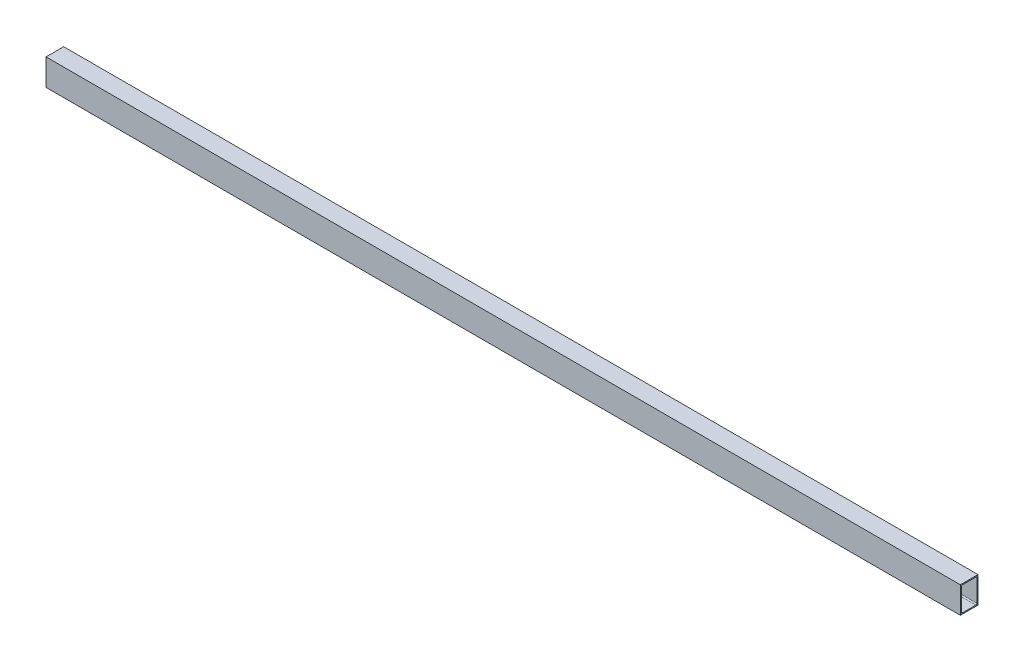
ISO-10303-21;
HEADER;
FILE_DESCRIPTION(('STEP AP214'),'2;1');
FILE_NAME('part.step','',(''),(''),'','','');
FILE_SCHEMA(('AUTOMOTIVE_DESIGN { 1 0 10303 214 1 1 1 1 }'));
ENDSEC;
DATA;
#1=APPLICATION_CONTEXT('core data for automotive mechanical design processes');
#2=APPLICATION_PROTOCOL_DEFINITION('international standard','automotive_design',2000,#1);
#3=PRODUCT_CONTEXT('',#1,'mechanical');
#4=PRODUCT('Part','Part','',(#3));
#5=PRODUCT_RELATED_PRODUCT_CATEGORY('part','',(#4));
#6=PRODUCT_DEFINITION_FORMATION('','',#4);
#7=PRODUCT_DEFINITION_CONTEXT('part definition',#1,'design');
#8=PRODUCT_DEFINITION('design','',#6,#7);
#9=PRODUCT_DEFINITION_SHAPE('','',#8);
#10=(LENGTH_UNIT() NAMED_UNIT(*) SI_UNIT(.MILLI.,.METRE.));
#11=(NAMED_UNIT(*) PLANE_ANGLE_UNIT() SI_UNIT($,.RADIAN.));
#12=(NAMED_UNIT(*) SI_UNIT($,.STERADIAN.) SOLID_ANGLE_UNIT());
#13=UNCERTAINTY_MEASURE_WITH_UNIT(LENGTH_MEASURE(1.E-05),#10,'distance_accuracy_value','');
#14=(GEOMETRIC_REPRESENTATION_CONTEXT(3) GLOBAL_UNCERTAINTY_ASSIGNED_CONTEXT((#13)) GLOBAL_UNIT_ASSIGNED_CONTEXT((#10,
#11,#12)) REPRESENTATION_CONTEXT('',''));
#15=CARTESIAN_POINT('',(0.,0.,0.));
#16=DIRECTION('',(0.,0.,1.));
#17=DIRECTION('',(1.,0.,0.));
#18=AXIS2_PLACEMENT_3D('',#15,#16,#17);
#19=CARTESIAN_POINT('',(5265.200001456,0.,0.));
#20=DIRECTION('',(0.,1.,0.));
#21=DIRECTION('',(0.,0.,1.));
#22=AXIS2_PLACEMENT_3D('',#19,#20,#21);
#23=PLANE('',#22);
#24=DIRECTION('',(0.,0.,-1.));
#25=VECTOR('',#24,1.);
#26=CARTESIAN_POINT('',(2480.200000728,0.,0.));
#27=LINE('',#26,#25);
#28=CARTESIAN_POINT('',(2480.200000728,0.,101.6));
#29=VERTEX_POINT('',#28);
#30=CARTESIAN_POINT('',(2480.200000728,0.,0.));
#31=VERTEX_POINT('',#30);
#32=EDGE_CURVE('E11',#29,#31,#27,.T.);
#33=ORIENTED_EDGE('',*,*,#32,.F.);
#34=DIRECTION('',(-1.,0.,0.));
#35=VECTOR('',#34,1.);
#36=CARTESIAN_POINT('',(5265.200001456,0.,101.6));
#37=LINE('',#36,#35);
#38=CARTESIAN_POINT('',(0.,0.,101.6));
#39=VERTEX_POINT('',#38);
#40=EDGE_CURVE('E230',#29,#39,#37,.T.);
#41=ORIENTED_EDGE('',*,*,#40,.T.);
#42=DIRECTION('',(0.,0.,-1.));
#43=VECTOR('',#42,1.);
#44=CARTESIAN_POINT('',(0.,0.,0.));
#45=LINE('',#44,#43);
#46=CARTESIAN_POINT('',(0.,0.,0.));
#47=VERTEX_POINT('',#46);
#48=EDGE_CURVE('E211',#39,#47,#45,.T.);
#49=ORIENTED_EDGE('',*,*,#48,.T.);
#50=DIRECTION('',(-1.,0.,0.));
#51=VECTOR('',#50,1.);
#52=CARTESIAN_POINT('',(5265.200001456,0.,0.));
#53=LINE('',#52,#51);
#54=EDGE_CURVE('E217',#31,#47,#53,.T.);
#55=ORIENTED_EDGE('',*,*,#54,.F.);
#56=EDGE_LOOP('',(#33,#41,#49,#55));
#57=FACE_BOUND('',#56,.T.);
#58=ADVANCED_FACE('F35',(#57),#23,.F.);
#59=DIRECTION('',(0.,0.,1.));
#60=VECTOR('',#59,1.);
#61=CARTESIAN_POINT('',(2785.000000728,0.,0.));
#62=LINE('',#61,#60);
#63=CARTESIAN_POINT('',(2785.000000728,0.,0.));
#64=VERTEX_POINT('',#63);
#65=CARTESIAN_POINT('',(2785.000000728,0.,101.6));
#66=VERTEX_POINT('',#65);
#67=EDGE_CURVE('E44',#64,#66,#62,.T.);
#68=ORIENTED_EDGE('',*,*,#67,.F.);
#69=CARTESIAN_POINT('',(5265.200001456,0.,0.));
#70=VERTEX_POINT('',#69);
#71=EDGE_CURVE('E227',#70,#64,#53,.T.);
#72=ORIENTED_EDGE('',*,*,#71,.F.);
#73=DIRECTION('',(0.,0.,-1.));
#74=VECTOR('',#73,1.);
#75=CARTESIAN_POINT('',(5265.200001456,0.,0.));
#76=LINE('',#75,#74);
#77=CARTESIAN_POINT('',(5265.200001456,0.,101.6));
#78=VERTEX_POINT('',#77);
#79=EDGE_CURVE('E215',#78,#70,#76,.T.);
#80=ORIENTED_EDGE('',*,*,#79,.F.);
#81=EDGE_CURVE('E232',#78,#66,#37,.T.);
#82=ORIENTED_EDGE('',*,*,#81,.T.);
#83=EDGE_LOOP('',(#68,#72,#80,#82));
#84=FACE_BOUND('',#83,.T.);
#85=ADVANCED_FACE('F267',(#84),#23,.F.);
#86=CARTESIAN_POINT('',(5265.200001456,0.,0.));
#87=DIRECTION('',(1.,0.,0.));
#88=DIRECTION('',(0.,0.,-1.));
#89=AXIS2_PLACEMENT_3D('',#86,#87,#88);
#90=PLANE('',#89);
#91=DIRECTION('',(0.,1.,0.));
#92=VECTOR('',#91,1.);
#93=CARTESIAN_POINT('',(5265.200001456,0.,0.));
#94=LINE('',#93,#92);
#95=CARTESIAN_POINT('',(5265.200001456,152.4,0.));
#96=VERTEX_POINT('',#95);
#97=EDGE_CURVE('E207',#70,#96,#94,.T.);
#98=ORIENTED_EDGE('',*,*,#97,.T.);
#99=DIRECTION('',(0.,0.,1.));
#100=VECTOR('',#99,1.);
#101=CARTESIAN_POINT('',(5265.200001456,152.4,0.));
#102=LINE('',#101,#100);
#103=CARTESIAN_POINT('',(5265.200001456,152.4,101.6));
#104=VERTEX_POINT('',#103);
#105=EDGE_CURVE('E210',#96,#104,#102,.T.);
#106=ORIENTED_EDGE('',*,*,#105,.T.);
#107=DIRECTION('',(0.,-1.,0.));
#108=VECTOR('',#107,1.);
#109=CARTESIAN_POINT('',(5265.200001456,0.,101.6));
#110=LINE('',#109,#108);
#111=EDGE_CURVE('E213',#104,#78,#110,.T.);
#112=ORIENTED_EDGE('',*,*,#111,.T.);
#113=ORIENTED_EDGE('',*,*,#79,.T.);
#114=EDGE_LOOP('',(#98,#106,#112,#113));
#115=FACE_BOUND('',#114,.T.);
#116=DIRECTION('',(0.,0.,-1.));
#117=VECTOR('',#116,1.);
#118=CARTESIAN_POINT('',(5265.200001456,6.35,12.7));
#119=LINE('',#118,#117);
#120=CARTESIAN_POINT('',(5265.200001456,6.35,88.8999999999999));
#121=VERTEX_POINT('',#120);
#122=CARTESIAN_POINT('',(5265.200001456,6.35,12.7));
#123=VERTEX_POINT('',#122);
#124=EDGE_CURVE('E146',#121,#123,#119,.T.);
#125=ORIENTED_EDGE('',*,*,#124,.F.);
#126=CARTESIAN_POINT('',(5265.200001456,12.7,88.9));
#127=DIRECTION('',(1.,0.,0.));
#128=DIRECTION('',(0.,0.,-1.));
#129=AXIS2_PLACEMENT_3D('',#126,#127,#128);
#130=CIRCLE('',#129,6.35);
#131=CARTESIAN_POINT('',(5265.200001456,12.7,95.25));
#132=VERTEX_POINT('',#131);
#133=EDGE_CURVE('E136',#132,#121,#130,.T.);
#134=ORIENTED_EDGE('',*,*,#133,.F.);
#135=DIRECTION('',(0.,-1.,0.));
#136=VECTOR('',#135,1.);
#137=CARTESIAN_POINT('',(5265.200001456,12.7,95.25));
#138=LINE('',#137,#136);
#139=CARTESIAN_POINT('',(5265.200001456,139.7,95.25));
#140=VERTEX_POINT('',#139);
#141=EDGE_CURVE('E173',#140,#132,#138,.T.);
#142=ORIENTED_EDGE('',*,*,#141,.F.);
#143=CARTESIAN_POINT('',(5265.200001456,139.7,88.9));
#144=DIRECTION('',(1.,0.,0.));
#145=DIRECTION('',(0.,0.,1.));
#146=AXIS2_PLACEMENT_3D('',#143,#144,#145);
#147=CIRCLE('',#146,6.34999999999999);
#148=CARTESIAN_POINT('',(5265.200001456,146.05,88.8999999999999));
#149=VERTEX_POINT('',#148);
#150=EDGE_CURVE('E170',#149,#140,#147,.T.);
#151=ORIENTED_EDGE('',*,*,#150,.F.);
#152=DIRECTION('',(0.,0.,1.));
#153=VECTOR('',#152,1.);
#154=CARTESIAN_POINT('',(5265.200001456,146.05,12.7));
#155=LINE('',#154,#153);
#156=CARTESIAN_POINT('',(5265.200001456,146.05,12.7));
#157=VERTEX_POINT('',#156);
#158=EDGE_CURVE('E168',#157,#149,#155,.T.);
#159=ORIENTED_EDGE('',*,*,#158,.F.);
#160=CARTESIAN_POINT('',(5265.200001456,139.7,12.7));
#161=DIRECTION('',(1.,0.,0.));
#162=DIRECTION('',(0.,0.,1.));
#163=AXIS2_PLACEMENT_3D('',#160,#161,#162);
#164=CIRCLE('',#163,6.35);
#165=CARTESIAN_POINT('',(5265.200001456,139.7,6.35));
#166=VERTEX_POINT('',#165);
#167=EDGE_CURVE('E166',#166,#157,#164,.T.);
#168=ORIENTED_EDGE('',*,*,#167,.F.);
#169=DIRECTION('',(0.,1.,0.));
#170=VECTOR('',#169,1.);
#171=CARTESIAN_POINT('',(5265.200001456,12.7,6.35));
#172=LINE('',#171,#170);
#173=CARTESIAN_POINT('',(5265.200001456,12.7,6.35));
#174=VERTEX_POINT('',#173);
#175=EDGE_CURVE('E162',#174,#166,#172,.T.);
#176=ORIENTED_EDGE('',*,*,#175,.F.);
#177=CARTESIAN_POINT('',(5265.200001456,12.7,12.7));
#178=DIRECTION('',(1.,0.,0.));
#179=DIRECTION('',(0.,0.,1.));
#180=AXIS2_PLACEMENT_3D('',#177,#178,#179);
#181=CIRCLE('',#180,6.35);
#182=EDGE_CURVE('E160',#123,#174,#181,.T.);
#183=ORIENTED_EDGE('',*,*,#182,.F.);
#184=EDGE_LOOP('',(#125,#134,#142,#151,#159,#168,#176,#183));
#185=FACE_BOUND('',#184,.T.);
#186=ADVANCED_FACE('F158',(#115,#185),#90,.T.);
#187=CARTESIAN_POINT('',(0.,0.,0.));
#188=DIRECTION('',(1.,0.,0.));
#189=DIRECTION('',(0.,0.,-1.));
#190=AXIS2_PLACEMENT_3D('',#187,#188,#189);
#191=PLANE('',#190);
#192=DIRECTION('',(0.,1.,0.));
#193=VECTOR('',#192,1.);
#194=CARTESIAN_POINT('',(0.,0.,0.));
#195=LINE('',#194,#193);
#196=CARTESIAN_POINT('',(0.,152.4,0.));
#197=VERTEX_POINT('',#196);
#198=EDGE_CURVE('E154',#47,#197,#195,.T.);
#199=ORIENTED_EDGE('',*,*,#198,.F.);
#200=ORIENTED_EDGE('',*,*,#48,.F.);
#201=DIRECTION('',(0.,-1.,0.));
#202=VECTOR('',#201,1.);
#203=CARTESIAN_POINT('',(0.,0.,101.6));
#204=LINE('',#203,#202);
#205=CARTESIAN_POINT('',(0.,152.4,101.6));
#206=VERTEX_POINT('',#205);
#207=EDGE_CURVE('E222',#206,#39,#204,.T.);
#208=ORIENTED_EDGE('',*,*,#207,.F.);
#209=DIRECTION('',(0.,0.,1.));
#210=VECTOR('',#209,1.);
#211=CARTESIAN_POINT('',(0.,152.4,0.));
#212=LINE('',#211,#210);
#213=EDGE_CURVE('E220',#197,#206,#212,.T.);
#214=ORIENTED_EDGE('',*,*,#213,.F.);
#215=EDGE_LOOP('',(#199,#200,#208,#214));
#216=FACE_BOUND('',#215,.T.);
#217=CARTESIAN_POINT('',(0.,12.7,88.9));
#218=DIRECTION('',(1.,0.,0.));
#219=DIRECTION('',(0.,0.,-1.));
#220=AXIS2_PLACEMENT_3D('',#217,#218,#219);
#221=CIRCLE('',#220,6.35);
#222=CARTESIAN_POINT('',(0.,12.7,95.25));
#223=VERTEX_POINT('',#222);
#224=CARTESIAN_POINT('',(0.,6.35,88.8999999999999));
#225=VERTEX_POINT('',#224);
#226=EDGE_CURVE('E175',#223,#225,#221,.T.);
#227=ORIENTED_EDGE('',*,*,#226,.T.);
#228=DIRECTION('',(0.,0.,-1.));
#229=VECTOR('',#228,1.);
#230=CARTESIAN_POINT('',(0.,6.35,12.7));
#231=LINE('',#230,#229);
#232=CARTESIAN_POINT('',(0.,6.35,12.7));
#233=VERTEX_POINT('',#232);
#234=EDGE_CURVE('E153',#225,#233,#231,.T.);
#235=ORIENTED_EDGE('',*,*,#234,.T.);
#236=CARTESIAN_POINT('',(0.,12.7,12.7));
#237=DIRECTION('',(1.,0.,0.));
#238=DIRECTION('',(0.,0.,1.));
#239=AXIS2_PLACEMENT_3D('',#236,#237,#238);
#240=CIRCLE('',#239,6.35);
#241=CARTESIAN_POINT('',(0.,12.7,6.35));
#242=VERTEX_POINT('',#241);
#243=EDGE_CURVE('E178',#233,#242,#240,.T.);
#244=ORIENTED_EDGE('',*,*,#243,.T.);
#245=DIRECTION('',(0.,1.,0.));
#246=VECTOR('',#245,1.);
#247=CARTESIAN_POINT('',(0.,12.7,6.35));
#248=LINE('',#247,#246);
#249=CARTESIAN_POINT('',(0.,139.7,6.35));
#250=VERTEX_POINT('',#249);
#251=EDGE_CURVE('E181',#242,#250,#248,.T.);
#252=ORIENTED_EDGE('',*,*,#251,.T.);
#253=CARTESIAN_POINT('',(0.,139.7,12.7));
#254=DIRECTION('',(1.,0.,0.));
#255=DIRECTION('',(0.,0.,1.));
#256=AXIS2_PLACEMENT_3D('',#253,#254,#255);
#257=CIRCLE('',#256,6.35);
#258=CARTESIAN_POINT('',(0.,146.05,12.7));
#259=VERTEX_POINT('',#258);
#260=EDGE_CURVE('E184',#250,#259,#257,.T.);
#261=ORIENTED_EDGE('',*,*,#260,.T.);
#262=DIRECTION('',(0.,0.,1.));
#263=VECTOR('',#262,1.);
#264=CARTESIAN_POINT('',(0.,146.05,12.7));
#265=LINE('',#264,#263);
#266=CARTESIAN_POINT('',(0.,146.05,88.8999999999999));
#267=VERTEX_POINT('',#266);
#268=EDGE_CURVE('E187',#259,#267,#265,.T.);
#269=ORIENTED_EDGE('',*,*,#268,.T.);
#270=CARTESIAN_POINT('',(0.,139.7,88.9));
#271=DIRECTION('',(1.,0.,0.));
#272=DIRECTION('',(0.,0.,1.));
#273=AXIS2_PLACEMENT_3D('',#270,#271,#272);
#274=CIRCLE('',#273,6.34999999999999);
#275=CARTESIAN_POINT('',(0.,139.7,95.25));
#276=VERTEX_POINT('',#275);
#277=EDGE_CURVE('E190',#267,#276,#274,.T.);
#278=ORIENTED_EDGE('',*,*,#277,.T.);
#279=DIRECTION('',(0.,-1.,0.));
#280=VECTOR('',#279,1.);
#281=CARTESIAN_POINT('',(0.,12.7,95.25));
#282=LINE('',#281,#280);
#283=EDGE_CURVE('E147',#276,#223,#282,.T.);
#284=ORIENTED_EDGE('',*,*,#283,.T.);
#285=EDGE_LOOP('',(#227,#235,#244,#252,#261,#269,#278,#284));
#286=FACE_BOUND('',#285,.T.);
#287=ADVANCED_FACE('F256',(#216,#286),#191,.F.);
#288=CARTESIAN_POINT('',(5265.200001456,0.,0.));
#289=DIRECTION('',(0.,0.,1.));
#290=DIRECTION('',(1.,0.,0.));
#291=AXIS2_PLACEMENT_3D('',#288,#289,#290);
#292=PLANE('',#291);
#293=ORIENTED_EDGE('',*,*,#198,.T.);
#294=DIRECTION('',(-1.,0.,0.));
#295=VECTOR('',#294,1.);
#296=CARTESIAN_POINT('',(5265.200001456,152.4,0.));
#297=LINE('',#296,#295);
#298=EDGE_CURVE('E239',#96,#197,#297,.T.);
#299=ORIENTED_EDGE('',*,*,#298,.F.);
#300=ORIENTED_EDGE('',*,*,#97,.F.);
#301=ORIENTED_EDGE('',*,*,#71,.T.);
#302=EDGE_CURVE('E231',#64,#31,#53,.T.);
#303=ORIENTED_EDGE('',*,*,#302,.T.);
#304=ORIENTED_EDGE('',*,*,#54,.T.);
#305=EDGE_LOOP('',(#293,#299,#300,#301,#303,#304));
#306=FACE_BOUND('',#305,.T.);
#307=ADVANCED_FACE('F37',(#306),#292,.F.);
#308=CARTESIAN_POINT('',(5265.200001456,152.4,0.));
#309=DIRECTION('',(0.,-1.,0.));
#310=DIRECTION('',(0.,0.,-1.));
#311=AXIS2_PLACEMENT_3D('',#308,#309,#310);
#312=PLANE('',#311);
#313=ORIENTED_EDGE('',*,*,#213,.T.);
#314=DIRECTION('',(-1.,0.,0.));
#315=VECTOR('',#314,1.);
#316=CARTESIAN_POINT('',(5265.200001456,152.4,101.6));
#317=LINE('',#316,#315);
#318=EDGE_CURVE('E235',#104,#206,#317,.T.);
#319=ORIENTED_EDGE('',*,*,#318,.F.);
#320=ORIENTED_EDGE('',*,*,#105,.F.);
#321=ORIENTED_EDGE('',*,*,#298,.T.);
#322=EDGE_LOOP('',(#313,#319,#320,#321));
#323=FACE_BOUND('',#322,.T.);
#324=ADVANCED_FACE('F248',(#323),#312,.F.);
#325=CARTESIAN_POINT('',(5265.200001456,0.,101.6));
#326=DIRECTION('',(0.,0.,-1.));
#327=DIRECTION('',(-1.,0.,0.));
#328=AXIS2_PLACEMENT_3D('',#325,#326,#327);
#329=PLANE('',#328);
#330=ORIENTED_EDGE('',*,*,#207,.T.);
#331=ORIENTED_EDGE('',*,*,#40,.F.);
#332=EDGE_CURVE('E236',#66,#29,#37,.T.);
#333=ORIENTED_EDGE('',*,*,#332,.F.);
#334=ORIENTED_EDGE('',*,*,#81,.F.);
#335=ORIENTED_EDGE('',*,*,#111,.F.);
#336=ORIENTED_EDGE('',*,*,#318,.T.);
#337=EDGE_LOOP('',(#330,#331,#333,#334,#335,#336));
#338=FACE_BOUND('',#337,.T.);
#339=ADVANCED_FACE('F260',(#338),#329,.F.);
#340=ORIENTED_EDGE('',*,*,#332,.T.);
#341=ORIENTED_EDGE('',*,*,#32,.T.);
#342=ORIENTED_EDGE('',*,*,#302,.F.);
#343=ORIENTED_EDGE('',*,*,#67,.T.);
#344=EDGE_LOOP('',(#340,#341,#342,#343));
#345=FACE_BOUND('',#344,.T.);
#346=ADVANCED_FACE('F268',(#345),#23,.F.);
#347=CARTESIAN_POINT('',(5265.200001456,12.7,88.9));
#348=DIRECTION('',(-1.,0.,0.));
#349=DIRECTION('',(0.,0.,1.));
#350=AXIS2_PLACEMENT_3D('',#347,#348,#349);
#351=CYLINDRICAL_SURFACE('',#350,6.35);
#352=ORIENTED_EDGE('',*,*,#226,.F.);
#353=DIRECTION('',(-1.,0.,0.));
#354=VECTOR('',#353,1.);
#355=CARTESIAN_POINT('',(5265.200001456,12.7,95.25));
#356=LINE('',#355,#354);
#357=EDGE_CURVE('E142',#132,#223,#356,.T.);
#358=ORIENTED_EDGE('',*,*,#357,.F.);
#359=ORIENTED_EDGE('',*,*,#133,.T.);
#360=DIRECTION('',(-1.,0.,0.));
#361=VECTOR('',#360,1.);
#362=CARTESIAN_POINT('',(5265.200001456,6.35,88.8999999999999));
#363=LINE('',#362,#361);
#364=EDGE_CURVE('E139',#121,#225,#363,.T.);
#365=ORIENTED_EDGE('',*,*,#364,.T.);
#366=EDGE_LOOP('',(#352,#358,#359,#365));
#367=FACE_BOUND('',#366,.T.);
#368=ADVANCED_FACE('F138',(#367),#351,.F.);
#369=CARTESIAN_POINT('',(5265.200001456,6.35,12.7));
#370=DIRECTION('',(0.,1.,0.));
#371=DIRECTION('',(0.,0.,1.));
#372=AXIS2_PLACEMENT_3D('',#369,#370,#371);
#373=PLANE('',#372);
#374=ORIENTED_EDGE('',*,*,#234,.F.);
#375=ORIENTED_EDGE('',*,*,#364,.F.);
#376=ORIENTED_EDGE('',*,*,#124,.T.);
#377=DIRECTION('',(-1.,0.,0.));
#378=VECTOR('',#377,1.);
#379=CARTESIAN_POINT('',(5265.200001456,6.35,12.7));
#380=LINE('',#379,#378);
#381=EDGE_CURVE('E155',#123,#233,#380,.T.);
#382=ORIENTED_EDGE('',*,*,#381,.T.);
#383=EDGE_LOOP('',(#374,#375,#376,#382));
#384=FACE_BOUND('',#383,.T.);
#385=ADVANCED_FACE('F150',(#384),#373,.T.);
#386=CARTESIAN_POINT('',(5265.200001456,12.7,12.7));
#387=DIRECTION('',(-1.,0.,0.));
#388=DIRECTION('',(0.,0.,1.));
#389=AXIS2_PLACEMENT_3D('',#386,#387,#388);
#390=CYLINDRICAL_SURFACE('',#389,6.35);
#391=ORIENTED_EDGE('',*,*,#243,.F.);
#392=ORIENTED_EDGE('',*,*,#381,.F.);
#393=ORIENTED_EDGE('',*,*,#182,.T.);
#394=DIRECTION('',(-1.,0.,0.));
#395=VECTOR('',#394,1.);
#396=CARTESIAN_POINT('',(5265.200001456,12.7,6.35));
#397=LINE('',#396,#395);
#398=EDGE_CURVE('E204',#174,#242,#397,.T.);
#399=ORIENTED_EDGE('',*,*,#398,.T.);
#400=EDGE_LOOP('',(#391,#392,#393,#399));
#401=FACE_BOUND('',#400,.T.);
#402=ADVANCED_FACE('F299',(#401),#390,.F.);
#403=CARTESIAN_POINT('',(5265.200001456,12.7,6.35));
#404=DIRECTION('',(0.,0.,1.));
#405=DIRECTION('',(1.,0.,0.));
#406=AXIS2_PLACEMENT_3D('',#403,#404,#405);
#407=PLANE('',#406);
#408=ORIENTED_EDGE('',*,*,#251,.F.);
#409=ORIENTED_EDGE('',*,*,#398,.F.);
#410=ORIENTED_EDGE('',*,*,#175,.T.);
#411=DIRECTION('',(-1.,0.,0.));
#412=VECTOR('',#411,1.);
#413=CARTESIAN_POINT('',(5265.200001456,139.7,6.35));
#414=LINE('',#413,#412);
#415=EDGE_CURVE('E202',#166,#250,#414,.T.);
#416=ORIENTED_EDGE('',*,*,#415,.T.);
#417=EDGE_LOOP('',(#408,#409,#410,#416));
#418=FACE_BOUND('',#417,.T.);
#419=ADVANCED_FACE('F302',(#418),#407,.T.);
#420=CARTESIAN_POINT('',(5265.200001456,139.7,12.7));
#421=DIRECTION('',(-1.,0.,0.));
#422=DIRECTION('',(0.,0.,1.));
#423=AXIS2_PLACEMENT_3D('',#420,#421,#422);
#424=CYLINDRICAL_SURFACE('',#423,6.35);
#425=ORIENTED_EDGE('',*,*,#260,.F.);
#426=ORIENTED_EDGE('',*,*,#415,.F.);
#427=ORIENTED_EDGE('',*,*,#167,.T.);
#428=DIRECTION('',(-1.,0.,0.));
#429=VECTOR('',#428,1.);
#430=CARTESIAN_POINT('',(5265.200001456,146.05,12.7));
#431=LINE('',#430,#429);
#432=EDGE_CURVE('E200',#157,#259,#431,.T.);
#433=ORIENTED_EDGE('',*,*,#432,.T.);
#434=EDGE_LOOP('',(#425,#426,#427,#433));
#435=FACE_BOUND('',#434,.T.);
#436=ADVANCED_FACE('F306',(#435),#424,.F.);
#437=CARTESIAN_POINT('',(5265.200001456,146.05,12.7));
#438=DIRECTION('',(0.,-1.,0.));
#439=DIRECTION('',(0.,0.,-1.));
#440=AXIS2_PLACEMENT_3D('',#437,#438,#439);
#441=PLANE('',#440);
#442=ORIENTED_EDGE('',*,*,#268,.F.);
#443=ORIENTED_EDGE('',*,*,#432,.F.);
#444=ORIENTED_EDGE('',*,*,#158,.T.);
#445=DIRECTION('',(-1.,0.,0.));
#446=VECTOR('',#445,1.);
#447=CARTESIAN_POINT('',(5265.200001456,146.05,88.8999999999999));
#448=LINE('',#447,#446);
#449=EDGE_CURVE('E198',#149,#267,#448,.T.);
#450=ORIENTED_EDGE('',*,*,#449,.T.);
#451=EDGE_LOOP('',(#442,#443,#444,#450));
#452=FACE_BOUND('',#451,.T.);
#453=ADVANCED_FACE('F310',(#452),#441,.T.);
#454=CARTESIAN_POINT('',(5265.200001456,139.7,88.9));
#455=DIRECTION('',(-1.,0.,0.));
#456=DIRECTION('',(0.,0.,1.));
#457=AXIS2_PLACEMENT_3D('',#454,#455,#456);
#458=CYLINDRICAL_SURFACE('',#457,6.34999999999999);
#459=ORIENTED_EDGE('',*,*,#277,.F.);
#460=ORIENTED_EDGE('',*,*,#449,.F.);
#461=ORIENTED_EDGE('',*,*,#150,.T.);
#462=DIRECTION('',(-1.,0.,0.));
#463=VECTOR('',#462,1.);
#464=CARTESIAN_POINT('',(5265.200001456,139.7,95.25));
#465=LINE('',#464,#463);
#466=EDGE_CURVE('E196',#140,#276,#465,.T.);
#467=ORIENTED_EDGE('',*,*,#466,.T.);
#468=EDGE_LOOP('',(#459,#460,#461,#467));
#469=FACE_BOUND('',#468,.T.);
#470=ADVANCED_FACE('F314',(#469),#458,.F.);
#471=CARTESIAN_POINT('',(5265.200001456,12.7,95.25));
#472=DIRECTION('',(0.,0.,-1.));
#473=DIRECTION('',(0.,1.,0.));
#474=AXIS2_PLACEMENT_3D('',#471,#472,#473);
#475=PLANE('',#474);
#476=ORIENTED_EDGE('',*,*,#283,.F.);
#477=ORIENTED_EDGE('',*,*,#466,.F.);
#478=ORIENTED_EDGE('',*,*,#141,.T.);
#479=ORIENTED_EDGE('',*,*,#357,.T.);
#480=EDGE_LOOP('',(#476,#477,#478,#479));
#481=FACE_BOUND('',#480,.T.);
#482=ADVANCED_FACE('F318',(#481),#475,.T.);
#483=CLOSED_SHELL('',(#58,#85,#186,#287,#307,#324,#339,#346,#368,#385,#402,#419,#436,#453,#470,#482));
#484=MANIFOLD_SOLID_BREP('B2',#483);
#485=ADVANCED_BREP_SHAPE_REPRESENTATION('',(#18,#484),#14);
#486=SHAPE_DEFINITION_REPRESENTATION(#9,#485);
ENDSEC;
END-ISO-10303-21;
